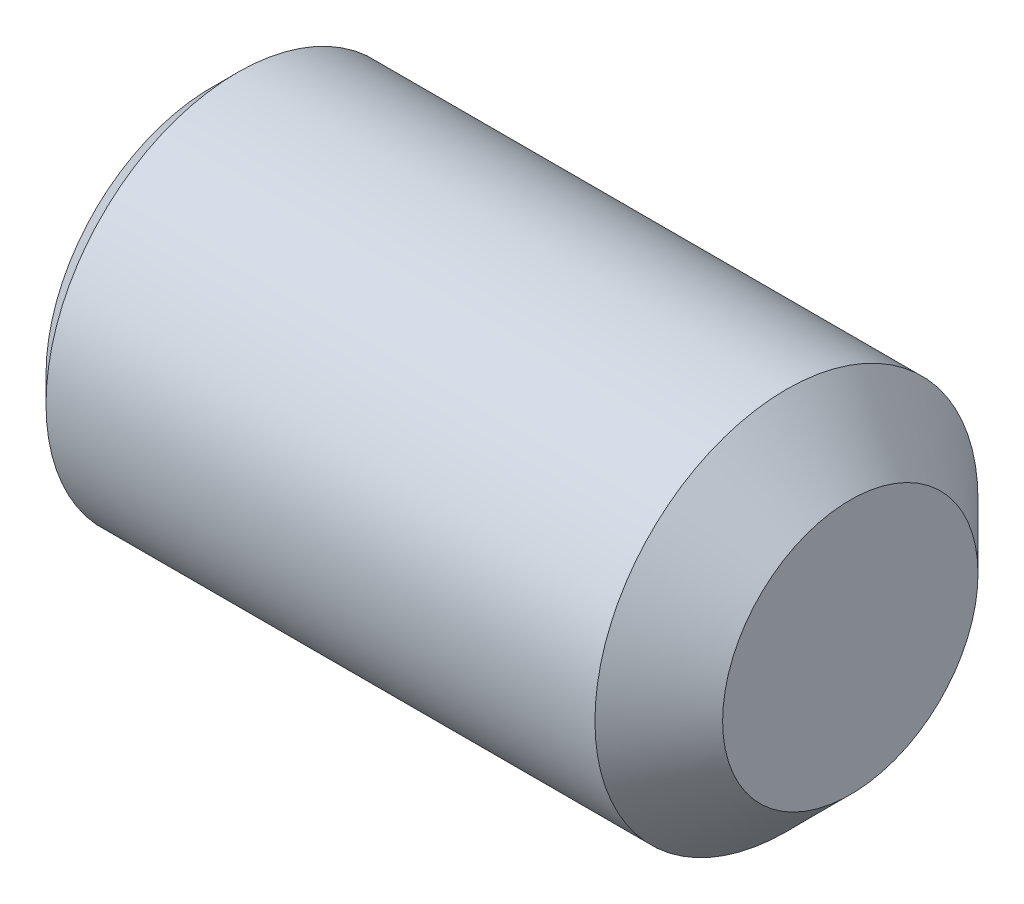
ISO-10303-21;
HEADER;
FILE_DESCRIPTION(('STEP AP214'),'2;1');
FILE_NAME('part.step','',(''),(''),'','','');
FILE_SCHEMA(('AUTOMOTIVE_DESIGN { 1 0 10303 214 1 1 1 1 }'));
ENDSEC;
DATA;
#1=APPLICATION_CONTEXT('core data for automotive mechanical design processes');
#2=APPLICATION_PROTOCOL_DEFINITION('international standard','automotive_design',2000,#1);
#3=PRODUCT_CONTEXT('',#1,'mechanical');
#4=PRODUCT('Part','Part','',(#3));
#5=PRODUCT_RELATED_PRODUCT_CATEGORY('part','',(#4));
#6=PRODUCT_DEFINITION_FORMATION('','',#4);
#7=PRODUCT_DEFINITION_CONTEXT('part definition',#1,'design');
#8=PRODUCT_DEFINITION('design','',#6,#7);
#9=PRODUCT_DEFINITION_SHAPE('','',#8);
#10=(LENGTH_UNIT() NAMED_UNIT(*) SI_UNIT(.MILLI.,.METRE.));
#11=(NAMED_UNIT(*) PLANE_ANGLE_UNIT() SI_UNIT($,.RADIAN.));
#12=(NAMED_UNIT(*) SI_UNIT($,.STERADIAN.) SOLID_ANGLE_UNIT());
#13=UNCERTAINTY_MEASURE_WITH_UNIT(LENGTH_MEASURE(1.E-05),#10,'distance_accuracy_value','');
#14=(GEOMETRIC_REPRESENTATION_CONTEXT(3) GLOBAL_UNCERTAINTY_ASSIGNED_CONTEXT((#13)) GLOBAL_UNIT_ASSIGNED_CONTEXT((#10,
#11,#12)) REPRESENTATION_CONTEXT('',''));
#15=CARTESIAN_POINT('',(0.,0.,0.));
#16=DIRECTION('',(0.,0.,1.));
#17=DIRECTION('',(1.,0.,0.));
#18=AXIS2_PLACEMENT_3D('',#15,#16,#17);
#19=CARTESIAN_POINT('',(2.,-2.97912738901847,0.));
#20=DIRECTION('',(-1.,0.,0.));
#21=DIRECTION('',(0.,0.,1.));
#22=AXIS2_PLACEMENT_3D('',#19,#20,#21);
#23=PLANE('',#22);
#24=CARTESIAN_POINT('',(2.,0.,0.));
#25=DIRECTION('',(-1.,0.,0.));
#26=DIRECTION('',(0.,0.,1.));
#27=AXIS2_PLACEMENT_3D('',#24,#25,#26);
#28=CIRCLE('',#27,1.48956369450923);
#29=CARTESIAN_POINT('',(2.,0.744781847254618,1.29));
#30=VERTEX_POINT('',#29);
#31=CARTESIAN_POINT('',(2.,1.48956369450923,0.));
#32=VERTEX_POINT('',#31);
#33=EDGE_CURVE('E50',#30,#32,#28,.T.);
#34=ORIENTED_EDGE('',*,*,#33,.F.);
#35=DIRECTION('',(0.,0.866025403784438,-0.5));
#36=VECTOR('',#35,1.);
#37=CARTESIAN_POINT('',(2.,0.,1.72));
#38=LINE('',#37,#36);
#39=CARTESIAN_POINT('',(2.,1.48956369450923,0.859999999999999));
#40=VERTEX_POINT('',#39);
#41=EDGE_CURVE('E233',#30,#40,#38,.T.);
#42=ORIENTED_EDGE('',*,*,#41,.T.);
#43=DIRECTION('',(0.,0.,-1.));
#44=VECTOR('',#43,1.);
#45=CARTESIAN_POINT('',(2.,1.48956369450923,0.859999999999999));
#46=LINE('',#45,#44);
#47=EDGE_CURVE('E226',#40,#32,#46,.T.);
#48=ORIENTED_EDGE('',*,*,#47,.T.);
#49=EDGE_LOOP('',(#34,#42,#48));
#50=FACE_BOUND('',#49,.T.);
#51=ADVANCED_FACE('F39',(#50),#23,.T.);
#52=CARTESIAN_POINT('',(2.,0.744781847254617,-1.29));
#53=VERTEX_POINT('',#52);
#54=EDGE_CURVE('E11',#32,#53,#28,.T.);
#55=ORIENTED_EDGE('',*,*,#54,.F.);
#56=CARTESIAN_POINT('',(2.,1.48956369450923,-0.860000000000001));
#57=VERTEX_POINT('',#56);
#58=EDGE_CURVE('E229',#32,#57,#46,.T.);
#59=ORIENTED_EDGE('',*,*,#58,.T.);
#60=DIRECTION('',(0.,-0.866025403784439,-0.5));
#61=VECTOR('',#60,1.);
#62=CARTESIAN_POINT('',(2.,1.48956369450923,-0.860000000000001));
#63=LINE('',#62,#61);
#64=EDGE_CURVE('E197',#57,#53,#63,.T.);
#65=ORIENTED_EDGE('',*,*,#64,.T.);
#66=EDGE_LOOP('',(#55,#59,#65));
#67=FACE_BOUND('',#66,.T.);
#68=ADVANCED_FACE('F126',(#67),#23,.T.);
#69=CARTESIAN_POINT('',(2.,-0.744781847254618,-1.29));
#70=VERTEX_POINT('',#69);
#71=EDGE_CURVE('E48',#53,#70,#28,.T.);
#72=ORIENTED_EDGE('',*,*,#71,.F.);
#73=CARTESIAN_POINT('',(2.,0.,-1.72));
#74=VERTEX_POINT('',#73);
#75=EDGE_CURVE('E225',#53,#74,#63,.T.);
#76=ORIENTED_EDGE('',*,*,#75,.T.);
#77=DIRECTION('',(0.,-0.866025403784438,0.5));
#78=VECTOR('',#77,1.);
#79=CARTESIAN_POINT('',(2.,0.,-1.72));
#80=LINE('',#79,#78);
#81=EDGE_CURVE('E242',#74,#70,#80,.T.);
#82=ORIENTED_EDGE('',*,*,#81,.T.);
#83=EDGE_LOOP('',(#72,#76,#82));
#84=FACE_BOUND('',#83,.T.);
#85=ADVANCED_FACE('F131',(#84),#23,.T.);
#86=CARTESIAN_POINT('',(2.,-1.48956369450923,0.));
#87=VERTEX_POINT('',#86);
#88=EDGE_CURVE('E263',#70,#87,#28,.T.);
#89=ORIENTED_EDGE('',*,*,#88,.F.);
#90=CARTESIAN_POINT('',(2.,-1.48956369450923,-0.86));
#91=VERTEX_POINT('',#90);
#92=EDGE_CURVE('E209',#70,#91,#80,.T.);
#93=ORIENTED_EDGE('',*,*,#92,.T.);
#94=DIRECTION('',(0.,0.,1.));
#95=VECTOR('',#94,1.);
#96=CARTESIAN_POINT('',(2.,-1.48956369450923,-0.86));
#97=LINE('',#96,#95);
#98=EDGE_CURVE('E238',#91,#87,#97,.T.);
#99=ORIENTED_EDGE('',*,*,#98,.T.);
#100=EDGE_LOOP('',(#89,#93,#99));
#101=FACE_BOUND('',#100,.T.);
#102=ADVANCED_FACE('F271',(#101),#23,.T.);
#103=CARTESIAN_POINT('',(2.,-0.744781847254617,1.29));
#104=VERTEX_POINT('',#103);
#105=EDGE_CURVE('E57',#87,#104,#28,.T.);
#106=ORIENTED_EDGE('',*,*,#105,.F.);
#107=CARTESIAN_POINT('',(2.,-1.48956369450923,0.86));
#108=VERTEX_POINT('',#107);
#109=EDGE_CURVE('E241',#87,#108,#97,.T.);
#110=ORIENTED_EDGE('',*,*,#109,.T.);
#111=DIRECTION('',(0.,0.866025403784439,0.5));
#112=VECTOR('',#111,1.);
#113=CARTESIAN_POINT('',(2.,-1.48956369450923,0.86));
#114=LINE('',#113,#112);
#115=EDGE_CURVE('E234',#108,#104,#114,.T.);
#116=ORIENTED_EDGE('',*,*,#115,.T.);
#117=EDGE_LOOP('',(#106,#110,#116));
#118=FACE_BOUND('',#117,.T.);
#119=ADVANCED_FACE('F124',(#118),#23,.T.);
#120=CARTESIAN_POINT('',(0.,2.598,0.));
#121=DIRECTION('',(1.,0.,0.));
#122=DIRECTION('',(0.,0.,-1.));
#123=AXIS2_PLACEMENT_3D('',#120,#121,#122);
#124=PLANE('',#123);
#125=DIRECTION('',(0.,0.,1.));
#126=VECTOR('',#125,1.);
#127=CARTESIAN_POINT('',(0.,-1.48956369450923,-0.86));
#128=LINE('',#127,#126);
#129=CARTESIAN_POINT('',(0.,-1.48956369450923,-0.86));
#130=VERTEX_POINT('',#129);
#131=CARTESIAN_POINT('',(0.,-1.48956369450923,0.86));
#132=VERTEX_POINT('',#131);
#133=EDGE_CURVE('E219',#130,#132,#128,.T.);
#134=ORIENTED_EDGE('',*,*,#133,.F.);
#135=DIRECTION('',(0.,-0.866025403784438,0.5));
#136=VECTOR('',#135,1.);
#137=CARTESIAN_POINT('',(0.,0.,-1.72));
#138=LINE('',#137,#136);
#139=CARTESIAN_POINT('',(0.,0.,-1.72));
#140=VERTEX_POINT('',#139);
#141=EDGE_CURVE('E65',#140,#130,#138,.T.);
#142=ORIENTED_EDGE('',*,*,#141,.F.);
#143=DIRECTION('',(0.,-0.866025403784439,-0.5));
#144=VECTOR('',#143,1.);
#145=CARTESIAN_POINT('',(0.,1.48956369450923,-0.860000000000001));
#146=LINE('',#145,#144);
#147=CARTESIAN_POINT('',(0.,1.48956369450923,-0.860000000000001));
#148=VERTEX_POINT('',#147);
#149=EDGE_CURVE('E206',#148,#140,#146,.T.);
#150=ORIENTED_EDGE('',*,*,#149,.F.);
#151=DIRECTION('',(0.,0.,-1.));
#152=VECTOR('',#151,1.);
#153=CARTESIAN_POINT('',(0.,1.48956369450923,0.859999999999999));
#154=LINE('',#153,#152);
#155=CARTESIAN_POINT('',(0.,1.48956369450923,0.859999999999999));
#156=VERTEX_POINT('',#155);
#157=EDGE_CURVE('E210',#156,#148,#154,.T.);
#158=ORIENTED_EDGE('',*,*,#157,.F.);
#159=DIRECTION('',(0.,0.866025403784438,-0.5));
#160=VECTOR('',#159,1.);
#161=CARTESIAN_POINT('',(0.,0.,1.72));
#162=LINE('',#161,#160);
#163=CARTESIAN_POINT('',(0.,0.,1.72));
#164=VERTEX_POINT('',#163);
#165=EDGE_CURVE('E213',#164,#156,#162,.T.);
#166=ORIENTED_EDGE('',*,*,#165,.F.);
#167=DIRECTION('',(0.,0.866025403784439,0.5));
#168=VECTOR('',#167,1.);
#169=CARTESIAN_POINT('',(0.,-1.48956369450923,0.86));
#170=LINE('',#169,#168);
#171=EDGE_CURVE('E216',#132,#164,#170,.T.);
#172=ORIENTED_EDGE('',*,*,#171,.F.);
#173=EDGE_LOOP('',(#134,#142,#150,#158,#166,#172));
#174=FACE_BOUND('',#173,.T.);
#175=CARTESIAN_POINT('',(0.,0.,0.));
#176=DIRECTION('',(-1.,0.,0.));
#177=DIRECTION('',(0.,0.,1.));
#178=AXIS2_PLACEMENT_3D('',#175,#176,#177);
#179=CIRCLE('',#178,2.598);
#180=CARTESIAN_POINT('',(0.,0.,2.598));
#181=VERTEX_POINT('',#180);
#182=EDGE_CURVE('E188',#181,#181,#179,.T.);
#183=ORIENTED_EDGE('',*,*,#182,.T.);
#184=EDGE_LOOP('',(#183));
#185=FACE_BOUND('',#184,.T.);
#186=ADVANCED_FACE('F41',(#174,#185),#124,.F.);
#187=CARTESIAN_POINT('',(10.,0.,0.));
#188=DIRECTION('',(-1.,0.,0.));
#189=DIRECTION('',(0.,0.,1.));
#190=AXIS2_PLACEMENT_3D('',#187,#188,#189);
#191=PLANE('',#190);
#192=CARTESIAN_POINT('',(10.,0.,0.));
#193=DIRECTION('',(-1.,0.,0.));
#194=DIRECTION('',(0.,0.,1.));
#195=AXIS2_PLACEMENT_3D('',#192,#193,#194);
#196=CIRCLE('',#195,2.);
#197=CARTESIAN_POINT('',(10.,0.,2.));
#198=VERTEX_POINT('',#197);
#199=EDGE_CURVE('E43',#198,#198,#196,.T.);
#200=ORIENTED_EDGE('',*,*,#199,.F.);
#201=EDGE_LOOP('',(#200));
#202=FACE_BOUND('',#201,.T.);
#203=ADVANCED_FACE('F167',(#202),#191,.F.);
#204=CARTESIAN_POINT('',(10.,0.,0.));
#205=DIRECTION('',(-1.,0.,0.));
#206=DIRECTION('',(0.,0.,1.));
#207=AXIS2_PLACEMENT_3D('',#204,#205,#206);
#208=CONICAL_SURFACE('',#207,2.,0.785398163397442);
#209=CARTESIAN_POINT('',(8.99999999999999,0.,0.));
#210=DIRECTION('',(-1.,0.,0.));
#211=DIRECTION('',(0.,0.,1.));
#212=AXIS2_PLACEMENT_3D('',#209,#210,#211);
#213=CIRCLE('',#212,3.);
#214=CARTESIAN_POINT('',(8.99999999999999,0.,3.));
#215=VERTEX_POINT('',#214);
#216=EDGE_CURVE('E180',#215,#215,#213,.T.);
#217=ORIENTED_EDGE('',*,*,#216,.F.);
#218=EDGE_LOOP('',(#217));
#219=FACE_BOUND('',#218,.T.);
#220=ORIENTED_EDGE('',*,*,#199,.T.);
#221=EDGE_LOOP('',(#220));
#222=FACE_BOUND('',#221,.T.);
#223=ADVANCED_FACE('F164',(#219,#222),#208,.T.);
#224=CARTESIAN_POINT('',(-0.277777777777778,0.,0.));
#225=DIRECTION('',(-1.,0.,0.));
#226=DIRECTION('',(0.,0.,1.));
#227=AXIS2_PLACEMENT_3D('',#224,#225,#226);
#228=CYLINDRICAL_SURFACE('',#227,3.);
#229=CARTESIAN_POINT('',(0.401999999999999,0.,0.));
#230=DIRECTION('',(-1.,0.,0.));
#231=DIRECTION('',(0.,0.,1.));
#232=AXIS2_PLACEMENT_3D('',#229,#230,#231);
#233=CIRCLE('',#232,2.99999999999999);
#234=CARTESIAN_POINT('',(0.401999999999999,0.,2.99999999999999));
#235=VERTEX_POINT('',#234);
#236=EDGE_CURVE('E184',#235,#235,#233,.T.);
#237=ORIENTED_EDGE('',*,*,#236,.F.);
#238=EDGE_LOOP('',(#237));
#239=FACE_BOUND('',#238,.T.);
#240=ORIENTED_EDGE('',*,*,#216,.T.);
#241=EDGE_LOOP('',(#240));
#242=FACE_BOUND('',#241,.T.);
#243=ADVANCED_FACE('F160',(#239,#242),#228,.T.);
#244=CARTESIAN_POINT('',(0.401999999999999,0.,0.));
#245=DIRECTION('',(1.,0.,0.));
#246=DIRECTION('',(0.,0.,-1.));
#247=AXIS2_PLACEMENT_3D('',#244,#245,#246);
#248=CONICAL_SURFACE('',#247,2.99999999999999,0.785398163397443);
#249=ORIENTED_EDGE('',*,*,#182,.F.);
#250=EDGE_LOOP('',(#249));
#251=FACE_BOUND('',#250,.T.);
#252=ORIENTED_EDGE('',*,*,#236,.T.);
#253=EDGE_LOOP('',(#252));
#254=FACE_BOUND('',#253,.T.);
#255=ADVANCED_FACE('F157',(#251,#254),#248,.T.);
#256=CARTESIAN_POINT('',(2.,0.,-1.72));
#257=DIRECTION('',(0.,-0.5,-0.866025403784439));
#258=DIRECTION('',(0.,0.866025403784438,-0.5));
#259=AXIS2_PLACEMENT_3D('',#256,#257,#258);
#260=PLANE('',#259);
#261=ORIENTED_EDGE('',*,*,#141,.T.);
#262=DIRECTION('',(-1.,0.,0.));
#263=VECTOR('',#262,1.);
#264=CARTESIAN_POINT('',(2.,-1.48956369450923,-0.86));
#265=LINE('',#264,#263);
#266=EDGE_CURVE('E194',#91,#130,#265,.T.);
#267=ORIENTED_EDGE('',*,*,#266,.F.);
#268=ORIENTED_EDGE('',*,*,#92,.F.);
#269=ORIENTED_EDGE('',*,*,#81,.F.);
#270=DIRECTION('',(-1.,0.,0.));
#271=VECTOR('',#270,1.);
#272=CARTESIAN_POINT('',(2.,0.,-1.72));
#273=LINE('',#272,#271);
#274=EDGE_CURVE('E193',#74,#140,#273,.T.);
#275=ORIENTED_EDGE('',*,*,#274,.T.);
#276=EDGE_LOOP('',(#261,#267,#268,#269,#275));
#277=FACE_BOUND('',#276,.T.);
#278=ADVANCED_FACE('F139',(#277),#260,.F.);
#279=CARTESIAN_POINT('',(2.,1.48956369450923,-0.860000000000001));
#280=DIRECTION('',(0.,0.5,-0.866025403784439));
#281=DIRECTION('',(0.,0.866025403784439,0.5));
#282=AXIS2_PLACEMENT_3D('',#279,#280,#281);
#283=PLANE('',#282);
#284=ORIENTED_EDGE('',*,*,#149,.T.);
#285=ORIENTED_EDGE('',*,*,#274,.F.);
#286=ORIENTED_EDGE('',*,*,#75,.F.);
#287=ORIENTED_EDGE('',*,*,#64,.F.);
#288=DIRECTION('',(-1.,0.,0.));
#289=VECTOR('',#288,1.);
#290=CARTESIAN_POINT('',(2.,1.48956369450923,-0.860000000000001));
#291=LINE('',#290,#289);
#292=EDGE_CURVE('E203',#57,#148,#291,.T.);
#293=ORIENTED_EDGE('',*,*,#292,.T.);
#294=EDGE_LOOP('',(#284,#285,#286,#287,#293));
#295=FACE_BOUND('',#294,.T.);
#296=ADVANCED_FACE('F135',(#295),#283,.F.);
#297=CARTESIAN_POINT('',(2.,1.48956369450923,0.859999999999999));
#298=DIRECTION('',(0.,1.,0.));
#299=DIRECTION('',(0.,0.,1.));
#300=AXIS2_PLACEMENT_3D('',#297,#298,#299);
#301=PLANE('',#300);
#302=ORIENTED_EDGE('',*,*,#157,.T.);
#303=ORIENTED_EDGE('',*,*,#292,.F.);
#304=ORIENTED_EDGE('',*,*,#58,.F.);
#305=ORIENTED_EDGE('',*,*,#47,.F.);
#306=DIRECTION('',(-1.,0.,0.));
#307=VECTOR('',#306,1.);
#308=CARTESIAN_POINT('',(2.,1.48956369450923,0.859999999999999));
#309=LINE('',#308,#307);
#310=EDGE_CURVE('E201',#40,#156,#309,.T.);
#311=ORIENTED_EDGE('',*,*,#310,.T.);
#312=EDGE_LOOP('',(#302,#303,#304,#305,#311));
#313=FACE_BOUND('',#312,.T.);
#314=ADVANCED_FACE('F138',(#313),#301,.F.);
#315=CARTESIAN_POINT('',(2.,0.,1.72));
#316=DIRECTION('',(0.,0.5,0.866025403784438));
#317=DIRECTION('',(0.,-0.866025403784438,0.5));
#318=AXIS2_PLACEMENT_3D('',#315,#316,#317);
#319=PLANE('',#318);
#320=ORIENTED_EDGE('',*,*,#165,.T.);
#321=ORIENTED_EDGE('',*,*,#310,.F.);
#322=ORIENTED_EDGE('',*,*,#41,.F.);
#323=CARTESIAN_POINT('',(2.,0.,1.72));
#324=VERTEX_POINT('',#323);
#325=EDGE_CURVE('E230',#324,#30,#38,.T.);
#326=ORIENTED_EDGE('',*,*,#325,.F.);
#327=DIRECTION('',(-1.,0.,0.));
#328=VECTOR('',#327,1.);
#329=CARTESIAN_POINT('',(2.,0.,1.72));
#330=LINE('',#329,#328);
#331=EDGE_CURVE('E199',#324,#164,#330,.T.);
#332=ORIENTED_EDGE('',*,*,#331,.T.);
#333=EDGE_LOOP('',(#320,#321,#322,#326,#332));
#334=FACE_BOUND('',#333,.T.);
#335=ADVANCED_FACE('F143',(#334),#319,.F.);
#336=CARTESIAN_POINT('',(2.,-1.48956369450923,0.86));
#337=DIRECTION('',(0.,-0.5,0.866025403784439));
#338=DIRECTION('',(0.,-0.866025403784439,-0.5));
#339=AXIS2_PLACEMENT_3D('',#336,#337,#338);
#340=PLANE('',#339);
#341=ORIENTED_EDGE('',*,*,#171,.T.);
#342=ORIENTED_EDGE('',*,*,#331,.F.);
#343=EDGE_CURVE('E237',#104,#324,#114,.T.);
#344=ORIENTED_EDGE('',*,*,#343,.F.);
#345=ORIENTED_EDGE('',*,*,#115,.F.);
#346=DIRECTION('',(-1.,0.,0.));
#347=VECTOR('',#346,1.);
#348=CARTESIAN_POINT('',(2.,-1.48956369450923,0.86));
#349=LINE('',#348,#347);
#350=EDGE_CURVE('E196',#108,#132,#349,.T.);
#351=ORIENTED_EDGE('',*,*,#350,.T.);
#352=EDGE_LOOP('',(#341,#342,#344,#345,#351));
#353=FACE_BOUND('',#352,.T.);
#354=ADVANCED_FACE('F147',(#353),#340,.F.);
#355=CARTESIAN_POINT('',(2.,-1.48956369450923,-0.86));
#356=DIRECTION('',(0.,-1.,0.));
#357=DIRECTION('',(0.,0.,-1.));
#358=AXIS2_PLACEMENT_3D('',#355,#356,#357);
#359=PLANE('',#358);
#360=ORIENTED_EDGE('',*,*,#133,.T.);
#361=ORIENTED_EDGE('',*,*,#350,.F.);
#362=ORIENTED_EDGE('',*,*,#109,.F.);
#363=ORIENTED_EDGE('',*,*,#98,.F.);
#364=ORIENTED_EDGE('',*,*,#266,.T.);
#365=EDGE_LOOP('',(#360,#361,#362,#363,#364));
#366=FACE_BOUND('',#365,.T.);
#367=ADVANCED_FACE('F121',(#366),#359,.F.);
#368=EDGE_CURVE('E179',#104,#30,#28,.T.);
#369=ORIENTED_EDGE('',*,*,#368,.F.);
#370=ORIENTED_EDGE('',*,*,#343,.T.);
#371=ORIENTED_EDGE('',*,*,#325,.T.);
#372=EDGE_LOOP('',(#369,#370,#371));
#373=FACE_BOUND('',#372,.T.);
#374=ADVANCED_FACE('F116',(#373),#23,.T.);
#375=CARTESIAN_POINT('',(2.86000000000001,0.,0.));
#376=DIRECTION('',(-1.,0.,0.));
#377=DIRECTION('',(0.,0.,1.));
#378=AXIS2_PLACEMENT_3D('',#375,#376,#377);
#379=CONICAL_SURFACE('',#378,0.,1.04719755119659);
#380=ORIENTED_EDGE('',*,*,#33,.T.);
#381=ORIENTED_EDGE('',*,*,#54,.T.);
#382=ORIENTED_EDGE('',*,*,#71,.T.);
#383=ORIENTED_EDGE('',*,*,#88,.T.);
#384=ORIENTED_EDGE('',*,*,#105,.T.);
#385=ORIENTED_EDGE('',*,*,#368,.T.);
#386=EDGE_LOOP('',(#380,#381,#382,#383,#384,#385));
#387=FACE_BOUND('',#386,.T.);
#388=CARTESIAN_POINT('',(2.86000000000001,0.,0.));
#389=VERTEX_POINT('',#388);
#390=VERTEX_LOOP('',#389);
#391=FACE_BOUND('',#390,.T.);
#392=ADVANCED_FACE('F114',(#387,#391),#379,.F.);
#393=CLOSED_SHELL('',(#51,#68,#85,#102,#119,#186,#203,#223,#243,#255,#278,#296,#314,#335,#354,
#367,#374,#392));
#394=MANIFOLD_SOLID_BREP('B2',#393);
#395=ADVANCED_BREP_SHAPE_REPRESENTATION('',(#18,#394),#14);
#396=SHAPE_DEFINITION_REPRESENTATION(#9,#395);
ENDSEC;
END-ISO-10303-21;
